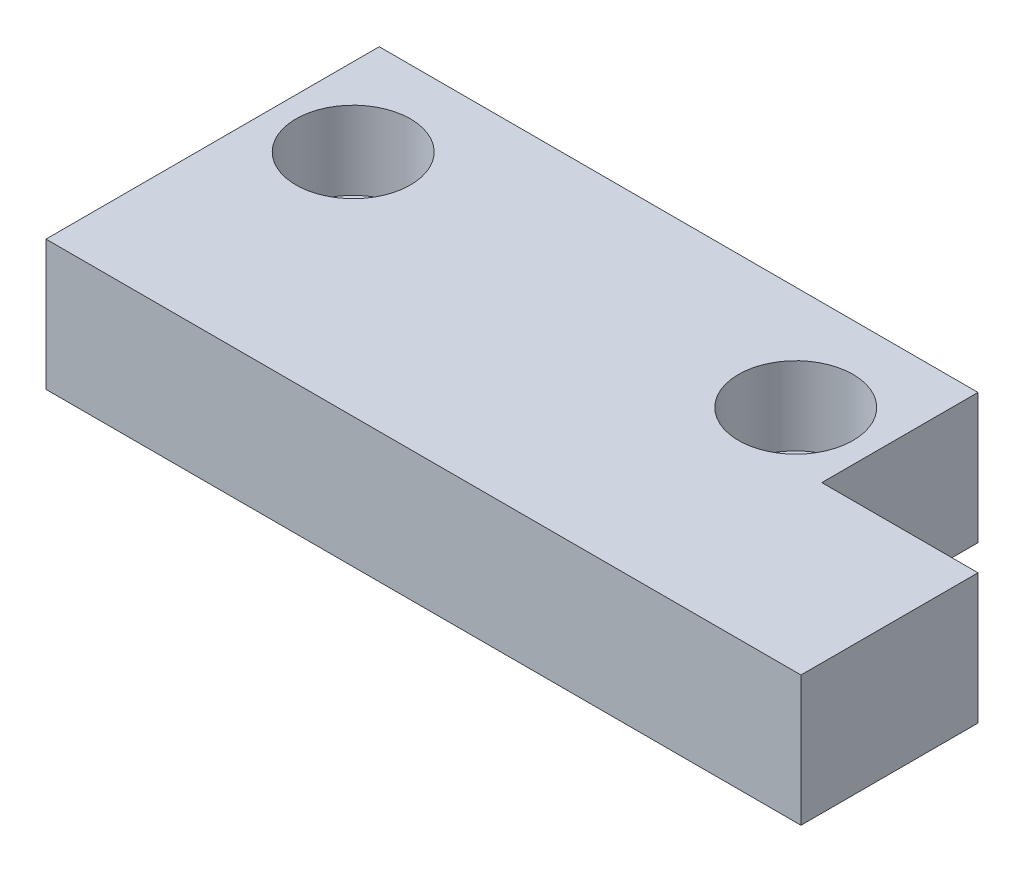
ISO-10303-21;
HEADER;
FILE_DESCRIPTION(('STEP AP214'),'2;1');
FILE_NAME('part.step','',(''),(''),'','','');
FILE_SCHEMA(('AUTOMOTIVE_DESIGN { 1 0 10303 214 1 1 1 1 }'));
ENDSEC;
DATA;
#1=APPLICATION_CONTEXT('core data for automotive mechanical design processes');
#2=APPLICATION_PROTOCOL_DEFINITION('international standard','automotive_design',2000,#1);
#3=PRODUCT_CONTEXT('',#1,'mechanical');
#4=PRODUCT('Part','Part','',(#3));
#5=PRODUCT_RELATED_PRODUCT_CATEGORY('part','',(#4));
#6=PRODUCT_DEFINITION_FORMATION('','',#4);
#7=PRODUCT_DEFINITION_CONTEXT('part definition',#1,'design');
#8=PRODUCT_DEFINITION('design','',#6,#7);
#9=PRODUCT_DEFINITION_SHAPE('','',#8);
#10=(LENGTH_UNIT() NAMED_UNIT(*) SI_UNIT(.MILLI.,.METRE.));
#11=(NAMED_UNIT(*) PLANE_ANGLE_UNIT() SI_UNIT($,.RADIAN.));
#12=(NAMED_UNIT(*) SI_UNIT($,.STERADIAN.) SOLID_ANGLE_UNIT());
#13=UNCERTAINTY_MEASURE_WITH_UNIT(LENGTH_MEASURE(1.E-05),#10,'distance_accuracy_value','');
#14=(GEOMETRIC_REPRESENTATION_CONTEXT(3) GLOBAL_UNCERTAINTY_ASSIGNED_CONTEXT((#13)) GLOBAL_UNIT_ASSIGNED_CONTEXT((#10,
#11,#12)) REPRESENTATION_CONTEXT('',''));
#15=CARTESIAN_POINT('',(0.,0.,0.));
#16=DIRECTION('',(0.,0.,1.));
#17=DIRECTION('',(1.,0.,0.));
#18=AXIS2_PLACEMENT_3D('',#15,#16,#17);
#19=CARTESIAN_POINT('',(0.,5.,0.));
#20=DIRECTION('',(0.,-1.,0.));
#21=DIRECTION('',(0.,0.,-1.));
#22=AXIS2_PLACEMENT_3D('',#19,#20,#21);
#23=PLANE('',#22);
#24=CARTESIAN_POINT('',(9.,5.,-16.));
#25=DIRECTION('',(0.,-1.,0.));
#26=DIRECTION('',(0.,0.,-1.));
#27=AXIS2_PLACEMENT_3D('',#24,#25,#26);
#28=CIRCLE('',#27,2.2);
#29=CARTESIAN_POINT('',(9.,5.,-18.2));
#30=VERTEX_POINT('',#29);
#31=EDGE_CURVE('E146',#30,#30,#28,.T.);
#32=ORIENTED_EDGE('',*,*,#31,.T.);
#33=EDGE_LOOP('',(#32));
#34=FACE_BOUND('',#33,.T.);
#35=DIRECTION('',(-1.,0.,0.));
#36=VECTOR('',#35,1.);
#37=CARTESIAN_POINT('',(0.,5.,-20.));
#38=LINE('',#37,#36);
#39=CARTESIAN_POINT('',(29.,5.,-20.));
#40=VERTEX_POINT('',#39);
#41=CARTESIAN_POINT('',(6.,5.,-20.));
#42=VERTEX_POINT('',#41);
#43=EDGE_CURVE('E11',#40,#42,#38,.T.);
#44=ORIENTED_EDGE('',*,*,#43,.T.);
#45=DIRECTION('',(0.,0.,-1.));
#46=VECTOR('',#45,1.);
#47=CARTESIAN_POINT('',(6.,5.,0.));
#48=LINE('',#47,#46);
#49=CARTESIAN_POINT('',(6.,5.,-7.2));
#50=VERTEX_POINT('',#49);
#51=EDGE_CURVE('E86',#50,#42,#48,.T.);
#52=ORIENTED_EDGE('',*,*,#51,.F.);
#53=DIRECTION('',(-1.,0.,0.));
#54=VECTOR('',#53,1.);
#55=CARTESIAN_POINT('',(6.,5.,-7.2));
#56=LINE('',#55,#54);
#57=CARTESIAN_POINT('',(35.,5.,-7.2));
#58=VERTEX_POINT('',#57);
#59=EDGE_CURVE('E126',#58,#50,#56,.T.);
#60=ORIENTED_EDGE('',*,*,#59,.F.);
#61=DIRECTION('',(0.,0.,-1.));
#62=VECTOR('',#61,1.);
#63=CARTESIAN_POINT('',(35.,5.,0.));
#64=LINE('',#63,#62);
#65=CARTESIAN_POINT('',(35.,5.,-14.));
#66=VERTEX_POINT('',#65);
#67=EDGE_CURVE('E42',#58,#66,#64,.T.);
#68=ORIENTED_EDGE('',*,*,#67,.T.);
#69=DIRECTION('',(1.,0.,0.));
#70=VECTOR('',#69,1.);
#71=CARTESIAN_POINT('',(35.,5.,-14.));
#72=LINE('',#71,#70);
#73=CARTESIAN_POINT('',(29.,5.,-14.));
#74=VERTEX_POINT('',#73);
#75=EDGE_CURVE('E107',#74,#66,#72,.T.);
#76=ORIENTED_EDGE('',*,*,#75,.F.);
#77=DIRECTION('',(0.,0.,1.));
#78=VECTOR('',#77,1.);
#79=CARTESIAN_POINT('',(29.,5.,-20.));
#80=LINE('',#79,#78);
#81=EDGE_CURVE('E105',#40,#74,#80,.T.);
#82=ORIENTED_EDGE('',*,*,#81,.F.);
#83=EDGE_LOOP('',(#44,#52,#60,#68,#76,#82));
#84=FACE_BOUND('',#83,.T.);
#85=CARTESIAN_POINT('',(26.,5.,-16.));
#86=DIRECTION('',(0.,-1.,0.));
#87=DIRECTION('',(0.,0.,-1.));
#88=AXIS2_PLACEMENT_3D('',#85,#86,#87);
#89=CIRCLE('',#88,2.2);
#90=CARTESIAN_POINT('',(26.,5.,-18.2));
#91=VERTEX_POINT('',#90);
#92=EDGE_CURVE('E153',#91,#91,#89,.T.);
#93=ORIENTED_EDGE('',*,*,#92,.T.);
#94=EDGE_LOOP('',(#93));
#95=FACE_BOUND('',#94,.T.);
#96=ADVANCED_FACE('F33',(#34,#84,#95),#23,.F.);
#97=CARTESIAN_POINT('',(0.,0.,0.));
#98=DIRECTION('',(0.,-1.,0.));
#99=DIRECTION('',(0.,0.,-1.));
#100=AXIS2_PLACEMENT_3D('',#97,#98,#99);
#101=PLANE('',#100);
#102=DIRECTION('',(0.,0.,1.));
#103=VECTOR('',#102,1.);
#104=CARTESIAN_POINT('',(6.,0.,0.));
#105=LINE('',#104,#103);
#106=CARTESIAN_POINT('',(6.,0.,-20.));
#107=VERTEX_POINT('',#106);
#108=CARTESIAN_POINT('',(6.,0.,-7.2));
#109=VERTEX_POINT('',#108);
#110=EDGE_CURVE('E58',#107,#109,#105,.T.);
#111=ORIENTED_EDGE('',*,*,#110,.F.);
#112=DIRECTION('',(-1.,0.,0.));
#113=VECTOR('',#112,1.);
#114=CARTESIAN_POINT('',(0.,0.,-20.));
#115=LINE('',#114,#113);
#116=CARTESIAN_POINT('',(29.,0.,-20.));
#117=VERTEX_POINT('',#116);
#118=EDGE_CURVE('E100',#117,#107,#115,.T.);
#119=ORIENTED_EDGE('',*,*,#118,.F.);
#120=DIRECTION('',(0.,0.,1.));
#121=VECTOR('',#120,1.);
#122=CARTESIAN_POINT('',(29.,0.,-20.));
#123=LINE('',#122,#121);
#124=CARTESIAN_POINT('',(29.,0.,-14.));
#125=VERTEX_POINT('',#124);
#126=EDGE_CURVE('E50',#117,#125,#123,.T.);
#127=ORIENTED_EDGE('',*,*,#126,.T.);
#128=DIRECTION('',(1.,0.,0.));
#129=VECTOR('',#128,1.);
#130=CARTESIAN_POINT('',(35.,0.,-14.));
#131=LINE('',#130,#129);
#132=CARTESIAN_POINT('',(35.,0.,-14.));
#133=VERTEX_POINT('',#132);
#134=EDGE_CURVE('E109',#125,#133,#131,.T.);
#135=ORIENTED_EDGE('',*,*,#134,.T.);
#136=DIRECTION('',(0.,0.,-1.));
#137=VECTOR('',#136,1.);
#138=CARTESIAN_POINT('',(35.,0.,0.));
#139=LINE('',#138,#137);
#140=CARTESIAN_POINT('',(35.,0.,-7.2));
#141=VERTEX_POINT('',#140);
#142=EDGE_CURVE('E134',#141,#133,#139,.T.);
#143=ORIENTED_EDGE('',*,*,#142,.F.);
#144=DIRECTION('',(-1.,0.,0.));
#145=VECTOR('',#144,1.);
#146=CARTESIAN_POINT('',(6.,0.,-7.2));
#147=LINE('',#146,#145);
#148=EDGE_CURVE('E125',#141,#109,#147,.T.);
#149=ORIENTED_EDGE('',*,*,#148,.T.);
#150=EDGE_LOOP('',(#111,#119,#127,#135,#143,#149));
#151=FACE_BOUND('',#150,.T.);
#152=CARTESIAN_POINT('',(9.,0.,-16.));
#153=DIRECTION('',(0.,1.,0.));
#154=DIRECTION('',(0.,0.,1.));
#155=AXIS2_PLACEMENT_3D('',#152,#153,#154);
#156=CIRCLE('',#155,1.2);
#157=CARTESIAN_POINT('',(9.,0.,-14.8));
#158=VERTEX_POINT('',#157);
#159=EDGE_CURVE('E116',#158,#158,#156,.T.);
#160=ORIENTED_EDGE('',*,*,#159,.T.);
#161=EDGE_LOOP('',(#160));
#162=FACE_BOUND('',#161,.T.);
#163=CARTESIAN_POINT('',(26.,0.,-16.));
#164=DIRECTION('',(0.,1.,0.));
#165=DIRECTION('',(0.,0.,1.));
#166=AXIS2_PLACEMENT_3D('',#163,#164,#165);
#167=CIRCLE('',#166,1.2);
#168=CARTESIAN_POINT('',(26.,0.,-14.8));
#169=VERTEX_POINT('',#168);
#170=EDGE_CURVE('E140',#169,#169,#167,.T.);
#171=ORIENTED_EDGE('',*,*,#170,.T.);
#172=EDGE_LOOP('',(#171));
#173=FACE_BOUND('',#172,.T.);
#174=ADVANCED_FACE('F175',(#151,#162,#173),#101,.T.);
#175=CARTESIAN_POINT('',(35.,5.,0.));
#176=DIRECTION('',(-1.,0.,0.));
#177=DIRECTION('',(0.,0.,1.));
#178=AXIS2_PLACEMENT_3D('',#175,#176,#177);
#179=PLANE('',#178);
#180=DIRECTION('',(0.,-1.,0.));
#181=VECTOR('',#180,1.);
#182=CARTESIAN_POINT('',(35.,5.,-14.));
#183=LINE('',#182,#181);
#184=EDGE_CURVE('E111',#66,#133,#183,.T.);
#185=ORIENTED_EDGE('',*,*,#184,.F.);
#186=ORIENTED_EDGE('',*,*,#67,.F.);
#187=DIRECTION('',(0.,-1.,0.));
#188=VECTOR('',#187,1.);
#189=CARTESIAN_POINT('',(35.,5.,-7.2));
#190=LINE('',#189,#188);
#191=EDGE_CURVE('E131',#58,#141,#190,.T.);
#192=ORIENTED_EDGE('',*,*,#191,.T.);
#193=ORIENTED_EDGE('',*,*,#142,.T.);
#194=EDGE_LOOP('',(#185,#186,#192,#193));
#195=FACE_BOUND('',#194,.T.);
#196=ADVANCED_FACE('F35',(#195),#179,.F.);
#197=CARTESIAN_POINT('',(0.,5.,-20.));
#198=DIRECTION('',(0.,0.,1.));
#199=DIRECTION('',(1.,0.,0.));
#200=AXIS2_PLACEMENT_3D('',#197,#198,#199);
#201=PLANE('',#200);
#202=ORIENTED_EDGE('',*,*,#118,.T.);
#203=DIRECTION('',(0.,1.,0.));
#204=VECTOR('',#203,1.);
#205=CARTESIAN_POINT('',(6.,-5.,-20.));
#206=LINE('',#205,#204);
#207=EDGE_CURVE('E89',#107,#42,#206,.T.);
#208=ORIENTED_EDGE('',*,*,#207,.T.);
#209=ORIENTED_EDGE('',*,*,#43,.F.);
#210=DIRECTION('',(0.,-1.,0.));
#211=VECTOR('',#210,1.);
#212=CARTESIAN_POINT('',(29.,5.,-20.));
#213=LINE('',#212,#211);
#214=EDGE_CURVE('E123',#40,#117,#213,.T.);
#215=ORIENTED_EDGE('',*,*,#214,.T.);
#216=EDGE_LOOP('',(#202,#208,#209,#215));
#217=FACE_BOUND('',#216,.T.);
#218=ADVANCED_FACE('F98',(#217),#201,.F.);
#219=CARTESIAN_POINT('',(6.,5.,-7.2));
#220=DIRECTION('',(0.,0.,1.));
#221=DIRECTION('',(1.,0.,0.));
#222=AXIS2_PLACEMENT_3D('',#219,#220,#221);
#223=PLANE('',#222);
#224=ORIENTED_EDGE('',*,*,#148,.F.);
#225=ORIENTED_EDGE('',*,*,#191,.F.);
#226=ORIENTED_EDGE('',*,*,#59,.T.);
#227=DIRECTION('',(0.,-1.,0.));
#228=VECTOR('',#227,1.);
#229=CARTESIAN_POINT('',(6.,5.,-7.2));
#230=LINE('',#229,#228);
#231=EDGE_CURVE('E90',#50,#109,#230,.T.);
#232=ORIENTED_EDGE('',*,*,#231,.T.);
#233=EDGE_LOOP('',(#224,#225,#226,#232));
#234=FACE_BOUND('',#233,.T.);
#235=ADVANCED_FACE('F189',(#234),#223,.T.);
#236=CARTESIAN_POINT('',(29.,5.,-20.));
#237=DIRECTION('',(1.,0.,0.));
#238=DIRECTION('',(0.,0.,-1.));
#239=AXIS2_PLACEMENT_3D('',#236,#237,#238);
#240=PLANE('',#239);
#241=ORIENTED_EDGE('',*,*,#126,.F.);
#242=ORIENTED_EDGE('',*,*,#214,.F.);
#243=ORIENTED_EDGE('',*,*,#81,.T.);
#244=DIRECTION('',(0.,-1.,0.));
#245=VECTOR('',#244,1.);
#246=CARTESIAN_POINT('',(29.,5.,-14.));
#247=LINE('',#246,#245);
#248=EDGE_CURVE('E121',#74,#125,#247,.T.);
#249=ORIENTED_EDGE('',*,*,#248,.T.);
#250=EDGE_LOOP('',(#241,#242,#243,#249));
#251=FACE_BOUND('',#250,.T.);
#252=ADVANCED_FACE('F193',(#251),#240,.T.);
#253=CARTESIAN_POINT('',(35.,5.,-14.));
#254=DIRECTION('',(0.,0.,-1.));
#255=DIRECTION('',(-1.,0.,0.));
#256=AXIS2_PLACEMENT_3D('',#253,#254,#255);
#257=PLANE('',#256);
#258=ORIENTED_EDGE('',*,*,#134,.F.);
#259=ORIENTED_EDGE('',*,*,#248,.F.);
#260=ORIENTED_EDGE('',*,*,#75,.T.);
#261=ORIENTED_EDGE('',*,*,#184,.T.);
#262=EDGE_LOOP('',(#258,#259,#260,#261));
#263=FACE_BOUND('',#262,.T.);
#264=ADVANCED_FACE('F198',(#263),#257,.T.);
#265=CARTESIAN_POINT('',(9.,5.,-16.));
#266=DIRECTION('',(0.,-1.,0.));
#267=DIRECTION('',(0.,0.,-1.));
#268=AXIS2_PLACEMENT_3D('',#265,#266,#267);
#269=CYLINDRICAL_SURFACE('',#268,1.2);
#270=CARTESIAN_POINT('',(9.,2.,-16.));
#271=DIRECTION('',(0.,-1.,0.));
#272=DIRECTION('',(0.,0.,-1.));
#273=AXIS2_PLACEMENT_3D('',#270,#271,#272);
#274=CIRCLE('',#273,1.2);
#275=CARTESIAN_POINT('',(9.,2.,-17.2));
#276=VERTEX_POINT('',#275);
#277=EDGE_CURVE('E138',#276,#276,#274,.T.);
#278=ORIENTED_EDGE('',*,*,#277,.F.);
#279=EDGE_LOOP('',(#278));
#280=FACE_BOUND('',#279,.T.);
#281=ORIENTED_EDGE('',*,*,#159,.F.);
#282=EDGE_LOOP('',(#281));
#283=FACE_BOUND('',#282,.T.);
#284=ADVANCED_FACE('F171',(#280,#283),#269,.F.);
#285=CARTESIAN_POINT('',(26.,5.,-16.));
#286=DIRECTION('',(0.,-1.,0.));
#287=DIRECTION('',(0.,0.,-1.));
#288=AXIS2_PLACEMENT_3D('',#285,#286,#287);
#289=CYLINDRICAL_SURFACE('',#288,1.2);
#290=CARTESIAN_POINT('',(26.,2.,-16.));
#291=DIRECTION('',(0.,-1.,0.));
#292=DIRECTION('',(0.,0.,-1.));
#293=AXIS2_PLACEMENT_3D('',#290,#291,#292);
#294=CIRCLE('',#293,1.2);
#295=CARTESIAN_POINT('',(26.,2.,-17.2));
#296=VERTEX_POINT('',#295);
#297=EDGE_CURVE('E37',#296,#296,#294,.T.);
#298=ORIENTED_EDGE('',*,*,#297,.F.);
#299=EDGE_LOOP('',(#298));
#300=FACE_BOUND('',#299,.T.);
#301=ORIENTED_EDGE('',*,*,#170,.F.);
#302=EDGE_LOOP('',(#301));
#303=FACE_BOUND('',#302,.T.);
#304=ADVANCED_FACE('F167',(#300,#303),#289,.F.);
#305=CARTESIAN_POINT('',(9.,2.,-16.));
#306=DIRECTION('',(0.,1.,0.));
#307=DIRECTION('',(0.,0.,1.));
#308=AXIS2_PLACEMENT_3D('',#305,#306,#307);
#309=CYLINDRICAL_SURFACE('',#308,2.2);
#310=CARTESIAN_POINT('',(9.,2.,-16.));
#311=DIRECTION('',(0.,-1.,0.));
#312=DIRECTION('',(0.,0.,-1.));
#313=AXIS2_PLACEMENT_3D('',#310,#311,#312);
#314=CIRCLE('',#313,2.2);
#315=CARTESIAN_POINT('',(9.,2.,-18.2));
#316=VERTEX_POINT('',#315);
#317=EDGE_CURVE('E141',#316,#316,#314,.T.);
#318=ORIENTED_EDGE('',*,*,#317,.T.);
#319=EDGE_LOOP('',(#318));
#320=FACE_BOUND('',#319,.T.);
#321=ORIENTED_EDGE('',*,*,#31,.F.);
#322=EDGE_LOOP('',(#321));
#323=FACE_BOUND('',#322,.T.);
#324=ADVANCED_FACE('F170',(#320,#323),#309,.F.);
#325=CARTESIAN_POINT('',(9.,2.,-16.));
#326=DIRECTION('',(0.,-1.,0.));
#327=DIRECTION('',(0.,0.,-1.));
#328=AXIS2_PLACEMENT_3D('',#325,#326,#327);
#329=PLANE('',#328);
#330=ORIENTED_EDGE('',*,*,#277,.T.);
#331=EDGE_LOOP('',(#330));
#332=FACE_BOUND('',#331,.T.);
#333=ORIENTED_EDGE('',*,*,#317,.F.);
#334=EDGE_LOOP('',(#333));
#335=FACE_BOUND('',#334,.T.);
#336=ADVANCED_FACE('F209',(#332,#335),#329,.F.);
#337=CARTESIAN_POINT('',(26.,2.,-16.));
#338=DIRECTION('',(0.,1.,0.));
#339=DIRECTION('',(0.,0.,1.));
#340=AXIS2_PLACEMENT_3D('',#337,#338,#339);
#341=CYLINDRICAL_SURFACE('',#340,2.2);
#342=CARTESIAN_POINT('',(26.,2.,-16.));
#343=DIRECTION('',(0.,-1.,0.));
#344=DIRECTION('',(0.,0.,-1.));
#345=AXIS2_PLACEMENT_3D('',#342,#343,#344);
#346=CIRCLE('',#345,2.2);
#347=CARTESIAN_POINT('',(26.,2.,-18.2));
#348=VERTEX_POINT('',#347);
#349=EDGE_CURVE('E156',#348,#348,#346,.T.);
#350=ORIENTED_EDGE('',*,*,#349,.T.);
#351=EDGE_LOOP('',(#350));
#352=FACE_BOUND('',#351,.T.);
#353=ORIENTED_EDGE('',*,*,#92,.F.);
#354=EDGE_LOOP('',(#353));
#355=FACE_BOUND('',#354,.T.);
#356=ADVANCED_FACE('F212',(#352,#355),#341,.F.);
#357=CARTESIAN_POINT('',(26.,2.,-16.));
#358=DIRECTION('',(0.,-1.,0.));
#359=DIRECTION('',(0.,0.,-1.));
#360=AXIS2_PLACEMENT_3D('',#357,#358,#359);
#361=PLANE('',#360);
#362=ORIENTED_EDGE('',*,*,#297,.T.);
#363=EDGE_LOOP('',(#362));
#364=FACE_BOUND('',#363,.T.);
#365=ORIENTED_EDGE('',*,*,#349,.F.);
#366=EDGE_LOOP('',(#365));
#367=FACE_BOUND('',#366,.T.);
#368=ADVANCED_FACE('F164',(#364,#367),#361,.F.);
#369=CARTESIAN_POINT('',(6.,-5.,0.));
#370=DIRECTION('',(1.,0.,0.));
#371=DIRECTION('',(0.,0.,-1.));
#372=AXIS2_PLACEMENT_3D('',#369,#370,#371);
#373=PLANE('',#372);
#374=ORIENTED_EDGE('',*,*,#110,.T.);
#375=ORIENTED_EDGE('',*,*,#231,.F.);
#376=ORIENTED_EDGE('',*,*,#51,.T.);
#377=ORIENTED_EDGE('',*,*,#207,.F.);
#378=EDGE_LOOP('',(#374,#375,#376,#377));
#379=FACE_BOUND('',#378,.T.);
#380=ADVANCED_FACE('F88',(#379),#373,.F.);
#381=CLOSED_SHELL('',(#96,#174,#196,#218,#235,#252,#264,#284,#304,#324,#336,#356,#368,#380));
#382=MANIFOLD_SOLID_BREP('B2',#381);
#383=ADVANCED_BREP_SHAPE_REPRESENTATION('',(#18,#382),#14);
#384=SHAPE_DEFINITION_REPRESENTATION(#9,#383);
ENDSEC;
END-ISO-10303-21;
